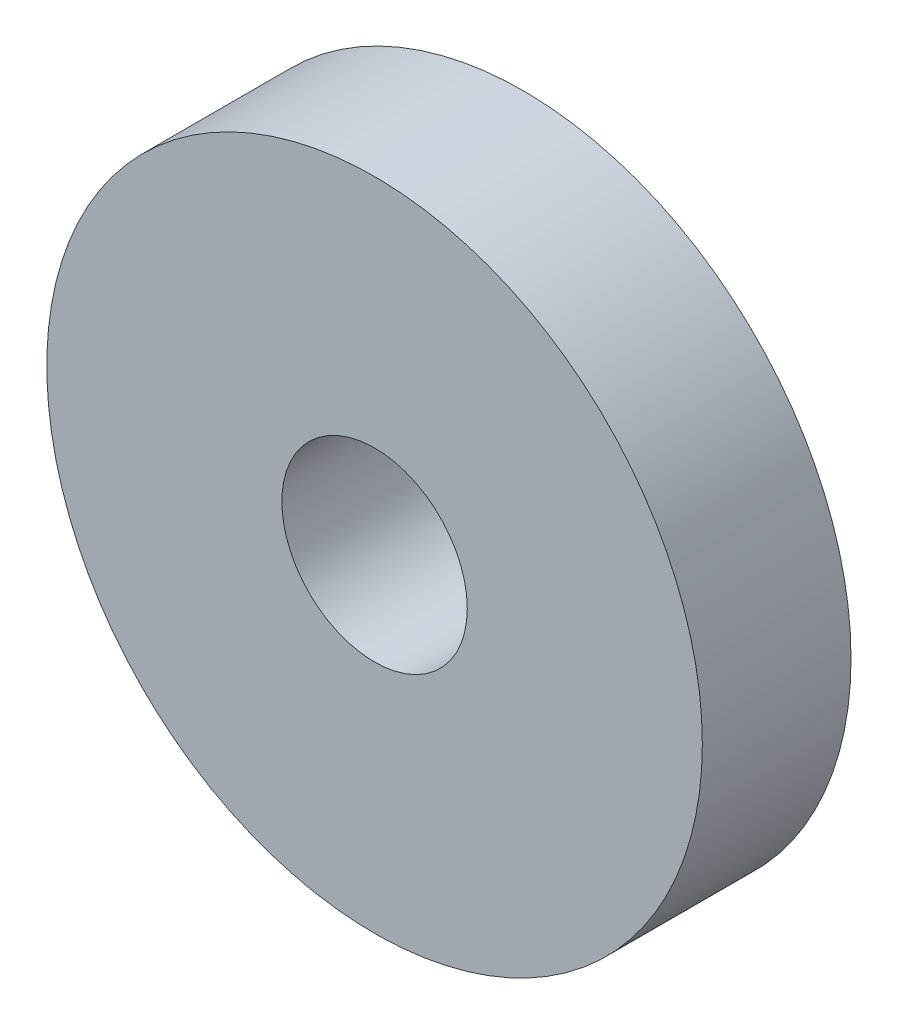
ISO-10303-21;
HEADER;
FILE_DESCRIPTION(('STEP AP214'),'2;1');
FILE_NAME('part.step','',(''),(''),'','','');
FILE_SCHEMA(('AUTOMOTIVE_DESIGN { 1 0 10303 214 1 1 1 1 }'));
ENDSEC;
DATA;
#1=APPLICATION_CONTEXT('core data for automotive mechanical design processes');
#2=APPLICATION_PROTOCOL_DEFINITION('international standard','automotive_design',2000,#1);
#3=PRODUCT_CONTEXT('',#1,'mechanical');
#4=PRODUCT('Part','Part','',(#3));
#5=PRODUCT_RELATED_PRODUCT_CATEGORY('part','',(#4));
#6=PRODUCT_DEFINITION_FORMATION('','',#4);
#7=PRODUCT_DEFINITION_CONTEXT('part definition',#1,'design');
#8=PRODUCT_DEFINITION('design','',#6,#7);
#9=PRODUCT_DEFINITION_SHAPE('','',#8);
#10=(LENGTH_UNIT() NAMED_UNIT(*) SI_UNIT(.MILLI.,.METRE.));
#11=(NAMED_UNIT(*) PLANE_ANGLE_UNIT() SI_UNIT($,.RADIAN.));
#12=(NAMED_UNIT(*) SI_UNIT($,.STERADIAN.) SOLID_ANGLE_UNIT());
#13=UNCERTAINTY_MEASURE_WITH_UNIT(LENGTH_MEASURE(1.E-05),#10,'distance_accuracy_value','');
#14=(GEOMETRIC_REPRESENTATION_CONTEXT(3) GLOBAL_UNCERTAINTY_ASSIGNED_CONTEXT((#13)) GLOBAL_UNIT_ASSIGNED_CONTEXT((#10,
#11,#12)) REPRESENTATION_CONTEXT('',''));
#15=CARTESIAN_POINT('',(0.,0.,0.));
#16=DIRECTION('',(0.,0.,1.));
#17=DIRECTION('',(1.,0.,0.));
#18=AXIS2_PLACEMENT_3D('',#15,#16,#17);
#19=CARTESIAN_POINT('',(0.,0.,6.35));
#20=DIRECTION('',(0.,0.,1.));
#21=DIRECTION('',(1.,0.,0.));
#22=AXIS2_PLACEMENT_3D('',#19,#20,#21);
#23=PLANE('',#22);
#24=CARTESIAN_POINT('',(0.,0.,6.35));
#25=DIRECTION('',(0.,0.,1.));
#26=DIRECTION('',(1.,0.,0.));
#27=AXIS2_PLACEMENT_3D('',#24,#25,#26);
#28=CIRCLE('',#27,14.);
#29=CARTESIAN_POINT('',(14.,0.,6.35));
#30=VERTEX_POINT('',#29);
#31=EDGE_CURVE('E10',#30,#30,#28,.T.);
#32=ORIENTED_EDGE('',*,*,#31,.T.);
#33=EDGE_LOOP('',(#32));
#34=FACE_BOUND('',#33,.T.);
#35=CARTESIAN_POINT('',(0.,0.,6.35));
#36=DIRECTION('',(0.,0.,1.));
#37=DIRECTION('',(1.,0.,0.));
#38=AXIS2_PLACEMENT_3D('',#35,#36,#37);
#39=CIRCLE('',#38,3.96);
#40=CARTESIAN_POINT('',(3.96,0.,6.35));
#41=VERTEX_POINT('',#40);
#42=EDGE_CURVE('E50',#41,#41,#39,.T.);
#43=ORIENTED_EDGE('',*,*,#42,.F.);
#44=EDGE_LOOP('',(#43));
#45=FACE_BOUND('',#44,.T.);
#46=ADVANCED_FACE('F37',(#34,#45),#23,.T.);
#47=CARTESIAN_POINT('',(0.,0.,0.));
#48=DIRECTION('',(0.,0.,1.));
#49=DIRECTION('',(1.,0.,0.));
#50=AXIS2_PLACEMENT_3D('',#47,#48,#49);
#51=PLANE('',#50);
#52=CARTESIAN_POINT('',(0.,0.,0.));
#53=DIRECTION('',(0.,0.,1.));
#54=DIRECTION('',(1.,0.,0.));
#55=AXIS2_PLACEMENT_3D('',#52,#53,#54);
#56=CIRCLE('',#55,14.);
#57=CARTESIAN_POINT('',(14.,0.,0.));
#58=VERTEX_POINT('',#57);
#59=EDGE_CURVE('E41',#58,#58,#56,.T.);
#60=ORIENTED_EDGE('',*,*,#59,.F.);
#61=EDGE_LOOP('',(#60));
#62=FACE_BOUND('',#61,.T.);
#63=CARTESIAN_POINT('',(0.,0.,0.));
#64=DIRECTION('',(0.,0.,1.));
#65=DIRECTION('',(1.,0.,0.));
#66=AXIS2_PLACEMENT_3D('',#63,#64,#65);
#67=CIRCLE('',#66,3.96);
#68=CARTESIAN_POINT('',(3.96,0.,0.));
#69=VERTEX_POINT('',#68);
#70=EDGE_CURVE('E52',#69,#69,#67,.T.);
#71=ORIENTED_EDGE('',*,*,#70,.T.);
#72=EDGE_LOOP('',(#71));
#73=FACE_BOUND('',#72,.T.);
#74=ADVANCED_FACE('F64',(#62,#73),#51,.F.);
#75=CARTESIAN_POINT('',(0.,0.,6.35));
#76=DIRECTION('',(0.,0.,-1.));
#77=DIRECTION('',(-1.,0.,0.));
#78=AXIS2_PLACEMENT_3D('',#75,#76,#77);
#79=CYLINDRICAL_SURFACE('',#78,14.);
#80=ORIENTED_EDGE('',*,*,#31,.F.);
#81=EDGE_LOOP('',(#80));
#82=FACE_BOUND('',#81,.T.);
#83=ORIENTED_EDGE('',*,*,#59,.T.);
#84=EDGE_LOOP('',(#83));
#85=FACE_BOUND('',#84,.T.);
#86=ADVANCED_FACE('F39',(#82,#85),#79,.T.);
#87=CARTESIAN_POINT('',(0.,0.,6.35));
#88=DIRECTION('',(0.,0.,-1.));
#89=DIRECTION('',(-1.,0.,0.));
#90=AXIS2_PLACEMENT_3D('',#87,#88,#89);
#91=CYLINDRICAL_SURFACE('',#90,3.96);
#92=ORIENTED_EDGE('',*,*,#42,.T.);
#93=EDGE_LOOP('',(#92));
#94=FACE_BOUND('',#93,.T.);
#95=ORIENTED_EDGE('',*,*,#70,.F.);
#96=EDGE_LOOP('',(#95));
#97=FACE_BOUND('',#96,.T.);
#98=ADVANCED_FACE('F60',(#94,#97),#91,.F.);
#99=CLOSED_SHELL('',(#46,#74,#86,#98));
#100=MANIFOLD_SOLID_BREP('B2',#99);
#101=ADVANCED_BREP_SHAPE_REPRESENTATION('',(#18,#100),#14);
#102=SHAPE_DEFINITION_REPRESENTATION(#9,#101);
ENDSEC;
END-ISO-10303-21;
